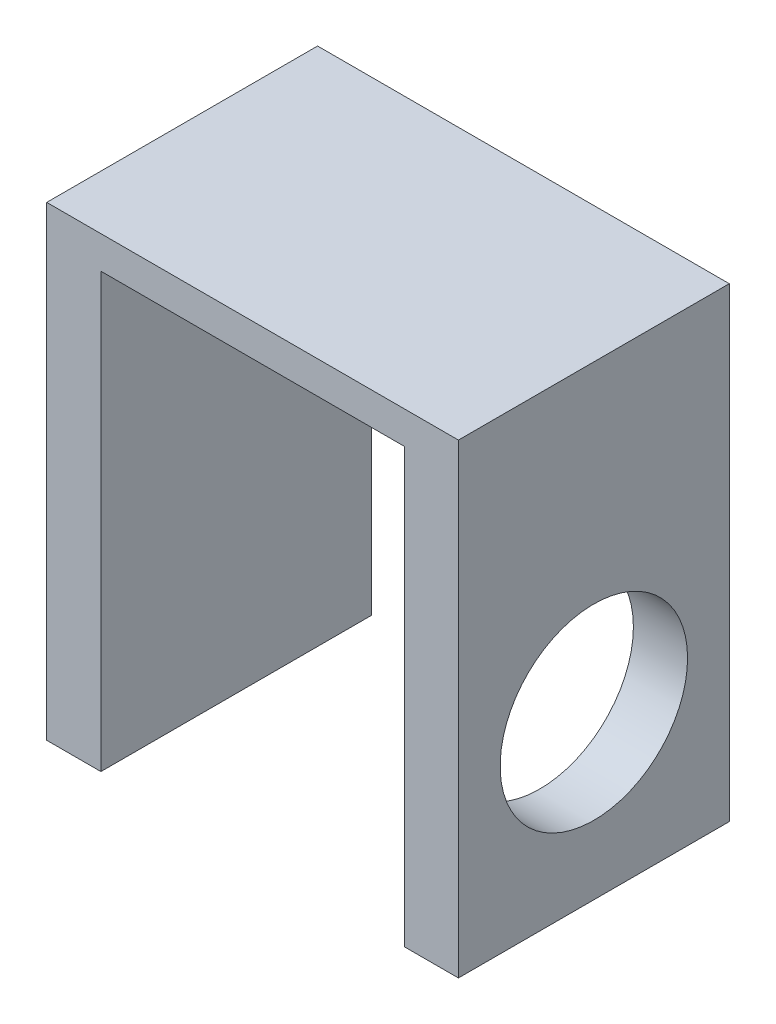
ISO-10303-21;
HEADER;
FILE_DESCRIPTION(('STEP AP214'),'2;1');
FILE_NAME('part.step','',(''),(''),'','','');
FILE_SCHEMA(('AUTOMOTIVE_DESIGN { 1 0 10303 214 1 1 1 1 }'));
ENDSEC;
DATA;
#1=APPLICATION_CONTEXT('core data for automotive mechanical design processes');
#2=APPLICATION_PROTOCOL_DEFINITION('international standard','automotive_design',2000,#1);
#3=PRODUCT_CONTEXT('',#1,'mechanical');
#4=PRODUCT('Part','Part','',(#3));
#5=PRODUCT_RELATED_PRODUCT_CATEGORY('part','',(#4));
#6=PRODUCT_DEFINITION_FORMATION('','',#4);
#7=PRODUCT_DEFINITION_CONTEXT('part definition',#1,'design');
#8=PRODUCT_DEFINITION('design','',#6,#7);
#9=PRODUCT_DEFINITION_SHAPE('','',#8);
#10=(LENGTH_UNIT() NAMED_UNIT(*) SI_UNIT(.MILLI.,.METRE.));
#11=(NAMED_UNIT(*) PLANE_ANGLE_UNIT() SI_UNIT($,.RADIAN.));
#12=(NAMED_UNIT(*) SI_UNIT($,.STERADIAN.) SOLID_ANGLE_UNIT());
#13=UNCERTAINTY_MEASURE_WITH_UNIT(LENGTH_MEASURE(1.E-05),#10,'distance_accuracy_value','');
#14=(GEOMETRIC_REPRESENTATION_CONTEXT(3) GLOBAL_UNCERTAINTY_ASSIGNED_CONTEXT((#13)) GLOBAL_UNIT_ASSIGNED_CONTEXT((#10,
#11,#12)) REPRESENTATION_CONTEXT('',''));
#15=CARTESIAN_POINT('',(0.,0.,0.));
#16=DIRECTION('',(0.,0.,1.));
#17=DIRECTION('',(1.,0.,0.));
#18=AXIS2_PLACEMENT_3D('',#15,#16,#17);
#19=CARTESIAN_POINT('',(0.,-6.,0.));
#20=DIRECTION('',(0.,-1.,0.));
#21=DIRECTION('',(0.,0.,-1.));
#22=AXIS2_PLACEMENT_3D('',#19,#20,#21);
#23=PLANE('',#22);
#24=DIRECTION('',(1.,0.,0.));
#25=VECTOR('',#24,1.);
#26=CARTESIAN_POINT('',(0.,-6.,0.));
#27=LINE('',#26,#25);
#28=CARTESIAN_POINT('',(9.99999999999999,-6.,0.));
#29=VERTEX_POINT('',#28);
#30=CARTESIAN_POINT('',(66.,-6.,0.));
#31=VERTEX_POINT('',#30);
#32=EDGE_CURVE('E64',#29,#31,#27,.T.);
#33=ORIENTED_EDGE('',*,*,#32,.F.);
#34=DIRECTION('',(0.,0.,-1.));
#35=VECTOR('',#34,1.);
#36=CARTESIAN_POINT('',(9.99999999999999,-6.,0.));
#37=LINE('',#36,#35);
#38=CARTESIAN_POINT('',(9.99999999999999,-6.,-50.));
#39=VERTEX_POINT('',#38);
#40=EDGE_CURVE('E127',#29,#39,#37,.T.);
#41=ORIENTED_EDGE('',*,*,#40,.T.);
#42=DIRECTION('',(-1.,0.,0.));
#43=VECTOR('',#42,1.);
#44=CARTESIAN_POINT('',(0.,-6.,-50.));
#45=LINE('',#44,#43);
#46=CARTESIAN_POINT('',(66.,-6.,-50.));
#47=VERTEX_POINT('',#46);
#48=EDGE_CURVE('E117',#47,#39,#45,.T.);
#49=ORIENTED_EDGE('',*,*,#48,.F.);
#50=DIRECTION('',(0.,0.,-1.));
#51=VECTOR('',#50,1.);
#52=CARTESIAN_POINT('',(66.,-6.,0.));
#53=LINE('',#52,#51);
#54=EDGE_CURVE('E139',#31,#47,#53,.T.);
#55=ORIENTED_EDGE('',*,*,#54,.F.);
#56=EDGE_LOOP('',(#33,#41,#49,#55));
#57=FACE_BOUND('',#56,.T.);
#58=ADVANCED_FACE('F39',(#57),#23,.T.);
#59=CARTESIAN_POINT('',(0.,-6.,0.));
#60=DIRECTION('',(-1.,0.,0.));
#61=DIRECTION('',(0.,0.,1.));
#62=AXIS2_PLACEMENT_3D('',#59,#60,#61);
#63=PLANE('',#62);
#64=DIRECTION('',(0.,0.,1.));
#65=VECTOR('',#64,1.);
#66=CARTESIAN_POINT('',(0.,0.,0.));
#67=LINE('',#66,#65);
#68=CARTESIAN_POINT('',(0.,0.,-50.));
#69=VERTEX_POINT('',#68);
#70=CARTESIAN_POINT('',(0.,0.,0.));
#71=VERTEX_POINT('',#70);
#72=EDGE_CURVE('E158',#69,#71,#67,.T.);
#73=ORIENTED_EDGE('',*,*,#72,.F.);
#74=DIRECTION('',(0.,1.,0.));
#75=VECTOR('',#74,1.);
#76=CARTESIAN_POINT('',(0.,-6.,-50.));
#77=LINE('',#76,#75);
#78=CARTESIAN_POINT('',(0.,-86.,-50.));
#79=VERTEX_POINT('',#78);
#80=EDGE_CURVE('E11',#79,#69,#77,.T.);
#81=ORIENTED_EDGE('',*,*,#80,.F.);
#82=DIRECTION('',(0.,0.,1.));
#83=VECTOR('',#82,1.);
#84=CARTESIAN_POINT('',(0.,-86.,0.));
#85=LINE('',#84,#83);
#86=CARTESIAN_POINT('',(0.,-86.,0.));
#87=VERTEX_POINT('',#86);
#88=EDGE_CURVE('E122',#79,#87,#85,.T.);
#89=ORIENTED_EDGE('',*,*,#88,.T.);
#90=DIRECTION('',(0.,1.,0.));
#91=VECTOR('',#90,1.);
#92=CARTESIAN_POINT('',(0.,-6.,0.));
#93=LINE('',#92,#91);
#94=EDGE_CURVE('E106',#87,#71,#93,.T.);
#95=ORIENTED_EDGE('',*,*,#94,.T.);
#96=EDGE_LOOP('',(#73,#81,#89,#95));
#97=FACE_BOUND('',#96,.T.);
#98=ADVANCED_FACE('F41',(#97),#63,.T.);
#99=CARTESIAN_POINT('',(0.,-6.,-50.));
#100=DIRECTION('',(0.,0.,-1.));
#101=DIRECTION('',(-1.,0.,0.));
#102=AXIS2_PLACEMENT_3D('',#99,#100,#101);
#103=PLANE('',#102);
#104=DIRECTION('',(0.,1.,0.));
#105=VECTOR('',#104,1.);
#106=CARTESIAN_POINT('',(66.,-86.,-50.));
#107=LINE('',#106,#105);
#108=CARTESIAN_POINT('',(66.,-86.,-50.));
#109=VERTEX_POINT('',#108);
#110=EDGE_CURVE('E150',#109,#47,#107,.T.);
#111=ORIENTED_EDGE('',*,*,#110,.T.);
#112=ORIENTED_EDGE('',*,*,#48,.T.);
#113=DIRECTION('',(0.,1.,0.));
#114=VECTOR('',#113,1.);
#115=CARTESIAN_POINT('',(9.99999999999999,-86.,-50.));
#116=LINE('',#115,#114);
#117=CARTESIAN_POINT('',(9.99999999999999,-86.,-50.));
#118=VERTEX_POINT('',#117);
#119=EDGE_CURVE('E56',#118,#39,#116,.T.);
#120=ORIENTED_EDGE('',*,*,#119,.F.);
#121=DIRECTION('',(-1.,0.,0.));
#122=VECTOR('',#121,1.);
#123=CARTESIAN_POINT('',(0.,-86.,-50.));
#124=LINE('',#123,#122);
#125=EDGE_CURVE('E134',#118,#79,#124,.T.);
#126=ORIENTED_EDGE('',*,*,#125,.T.);
#127=ORIENTED_EDGE('',*,*,#80,.T.);
#128=DIRECTION('',(-1.,0.,0.));
#129=VECTOR('',#128,1.);
#130=CARTESIAN_POINT('',(0.,0.,-50.));
#131=LINE('',#130,#129);
#132=CARTESIAN_POINT('',(76.,0.,-50.));
#133=VERTEX_POINT('',#132);
#134=EDGE_CURVE('E160',#133,#69,#131,.T.);
#135=ORIENTED_EDGE('',*,*,#134,.F.);
#136=DIRECTION('',(0.,1.,0.));
#137=VECTOR('',#136,1.);
#138=CARTESIAN_POINT('',(76.,-6.,-50.));
#139=LINE('',#138,#137);
#140=CARTESIAN_POINT('',(76.,-86.,-50.));
#141=VERTEX_POINT('',#140);
#142=EDGE_CURVE('E48',#141,#133,#139,.T.);
#143=ORIENTED_EDGE('',*,*,#142,.F.);
#144=DIRECTION('',(1.,0.,0.));
#145=VECTOR('',#144,1.);
#146=CARTESIAN_POINT('',(76.,-86.,-50.));
#147=LINE('',#146,#145);
#148=EDGE_CURVE('E147',#109,#141,#147,.T.);
#149=ORIENTED_EDGE('',*,*,#148,.F.);
#150=EDGE_LOOP('',(#111,#112,#120,#126,#127,#135,#143,#149));
#151=FACE_BOUND('',#150,.T.);
#152=ADVANCED_FACE('F180',(#151),#103,.T.);
#153=CARTESIAN_POINT('',(76.,-6.,0.));
#154=DIRECTION('',(1.,0.,0.));
#155=DIRECTION('',(0.,0.,-1.));
#156=AXIS2_PLACEMENT_3D('',#153,#154,#155);
#157=PLANE('',#156);
#158=CARTESIAN_POINT('',(76.,-56.,-25.));
#159=DIRECTION('',(1.,0.,0.));
#160=DIRECTION('',(0.,0.,-1.));
#161=AXIS2_PLACEMENT_3D('',#158,#159,#160);
#162=CIRCLE('',#161,17.3);
#163=CARTESIAN_POINT('',(76.,-56.,-42.3));
#164=VERTEX_POINT('',#163);
#165=EDGE_CURVE('E131',#164,#164,#162,.T.);
#166=ORIENTED_EDGE('',*,*,#165,.F.);
#167=EDGE_LOOP('',(#166));
#168=FACE_BOUND('',#167,.T.);
#169=ORIENTED_EDGE('',*,*,#142,.T.);
#170=DIRECTION('',(0.,0.,-1.));
#171=VECTOR('',#170,1.);
#172=CARTESIAN_POINT('',(76.,0.,0.));
#173=LINE('',#172,#171);
#174=CARTESIAN_POINT('',(76.,0.,0.));
#175=VERTEX_POINT('',#174);
#176=EDGE_CURVE('E165',#175,#133,#173,.T.);
#177=ORIENTED_EDGE('',*,*,#176,.F.);
#178=DIRECTION('',(0.,1.,0.));
#179=VECTOR('',#178,1.);
#180=CARTESIAN_POINT('',(76.,-6.,0.));
#181=LINE('',#180,#179);
#182=CARTESIAN_POINT('',(76.,-86.,0.));
#183=VERTEX_POINT('',#182);
#184=EDGE_CURVE('E116',#183,#175,#181,.T.);
#185=ORIENTED_EDGE('',*,*,#184,.F.);
#186=DIRECTION('',(0.,0.,1.));
#187=VECTOR('',#186,1.);
#188=CARTESIAN_POINT('',(76.,-86.,0.));
#189=LINE('',#188,#187);
#190=EDGE_CURVE('E140',#141,#183,#189,.T.);
#191=ORIENTED_EDGE('',*,*,#190,.F.);
#192=EDGE_LOOP('',(#169,#177,#185,#191));
#193=FACE_BOUND('',#192,.T.);
#194=ADVANCED_FACE('F175',(#168,#193),#157,.T.);
#195=CARTESIAN_POINT('',(0.,-6.,0.));
#196=DIRECTION('',(0.,0.,1.));
#197=DIRECTION('',(1.,0.,0.));
#198=AXIS2_PLACEMENT_3D('',#195,#196,#197);
#199=PLANE('',#198);
#200=ORIENTED_EDGE('',*,*,#184,.T.);
#201=DIRECTION('',(1.,0.,0.));
#202=VECTOR('',#201,1.);
#203=CARTESIAN_POINT('',(0.,0.,0.));
#204=LINE('',#203,#202);
#205=EDGE_CURVE('E111',#71,#175,#204,.T.);
#206=ORIENTED_EDGE('',*,*,#205,.F.);
#207=ORIENTED_EDGE('',*,*,#94,.F.);
#208=DIRECTION('',(1.,0.,0.));
#209=VECTOR('',#208,1.);
#210=CARTESIAN_POINT('',(0.,-86.,0.));
#211=LINE('',#210,#209);
#212=CARTESIAN_POINT('',(9.99999999999999,-86.,0.));
#213=VERTEX_POINT('',#212);
#214=EDGE_CURVE('E109',#87,#213,#211,.T.);
#215=ORIENTED_EDGE('',*,*,#214,.T.);
#216=DIRECTION('',(0.,1.,0.));
#217=VECTOR('',#216,1.);
#218=CARTESIAN_POINT('',(9.99999999999999,-86.,0.));
#219=LINE('',#218,#217);
#220=EDGE_CURVE('E137',#213,#29,#219,.T.);
#221=ORIENTED_EDGE('',*,*,#220,.T.);
#222=ORIENTED_EDGE('',*,*,#32,.T.);
#223=DIRECTION('',(0.,1.,0.));
#224=VECTOR('',#223,1.);
#225=CARTESIAN_POINT('',(66.,-86.,0.));
#226=LINE('',#225,#224);
#227=CARTESIAN_POINT('',(66.,-86.,0.));
#228=VERTEX_POINT('',#227);
#229=EDGE_CURVE('E155',#228,#31,#226,.T.);
#230=ORIENTED_EDGE('',*,*,#229,.F.);
#231=DIRECTION('',(-1.,0.,0.));
#232=VECTOR('',#231,1.);
#233=CARTESIAN_POINT('',(76.,-86.,0.));
#234=LINE('',#233,#232);
#235=EDGE_CURVE('E143',#183,#228,#234,.T.);
#236=ORIENTED_EDGE('',*,*,#235,.F.);
#237=EDGE_LOOP('',(#200,#206,#207,#215,#221,#222,#230,#236));
#238=FACE_BOUND('',#237,.T.);
#239=ADVANCED_FACE('F108',(#238),#199,.T.);
#240=CARTESIAN_POINT('',(0.,0.,0.));
#241=DIRECTION('',(0.,-1.,0.));
#242=DIRECTION('',(0.,0.,-1.));
#243=AXIS2_PLACEMENT_3D('',#240,#241,#242);
#244=PLANE('',#243);
#245=ORIENTED_EDGE('',*,*,#72,.T.);
#246=ORIENTED_EDGE('',*,*,#205,.T.);
#247=ORIENTED_EDGE('',*,*,#176,.T.);
#248=ORIENTED_EDGE('',*,*,#134,.T.);
#249=EDGE_LOOP('',(#245,#246,#247,#248));
#250=FACE_BOUND('',#249,.T.);
#251=ADVANCED_FACE('F178',(#250),#244,.F.);
#252=CARTESIAN_POINT('',(66.,-86.,0.));
#253=DIRECTION('',(1.,0.,0.));
#254=DIRECTION('',(0.,0.,-1.));
#255=AXIS2_PLACEMENT_3D('',#252,#253,#254);
#256=PLANE('',#255);
#257=CARTESIAN_POINT('',(66.,-56.,-25.));
#258=DIRECTION('',(1.,0.,0.));
#259=DIRECTION('',(0.,0.,-1.));
#260=AXIS2_PLACEMENT_3D('',#257,#258,#259);
#261=CIRCLE('',#260,17.3);
#262=CARTESIAN_POINT('',(66.,-56.,-42.3));
#263=VERTEX_POINT('',#262);
#264=EDGE_CURVE('E43',#263,#263,#261,.T.);
#265=ORIENTED_EDGE('',*,*,#264,.T.);
#266=EDGE_LOOP('',(#265));
#267=FACE_BOUND('',#266,.T.);
#268=ORIENTED_EDGE('',*,*,#54,.T.);
#269=ORIENTED_EDGE('',*,*,#110,.F.);
#270=DIRECTION('',(0.,0.,-1.));
#271=VECTOR('',#270,1.);
#272=CARTESIAN_POINT('',(66.,-86.,0.));
#273=LINE('',#272,#271);
#274=EDGE_CURVE('E145',#228,#109,#273,.T.);
#275=ORIENTED_EDGE('',*,*,#274,.F.);
#276=ORIENTED_EDGE('',*,*,#229,.T.);
#277=EDGE_LOOP('',(#268,#269,#275,#276));
#278=FACE_BOUND('',#277,.T.);
#279=ADVANCED_FACE('F185',(#267,#278),#256,.F.);
#280=CARTESIAN_POINT('',(0.,-86.,0.));
#281=DIRECTION('',(0.,1.,0.));
#282=DIRECTION('',(0.,0.,1.));
#283=AXIS2_PLACEMENT_3D('',#280,#281,#282);
#284=PLANE('',#283);
#285=ORIENTED_EDGE('',*,*,#190,.T.);
#286=ORIENTED_EDGE('',*,*,#235,.T.);
#287=ORIENTED_EDGE('',*,*,#274,.T.);
#288=ORIENTED_EDGE('',*,*,#148,.T.);
#289=EDGE_LOOP('',(#285,#286,#287,#288));
#290=FACE_BOUND('',#289,.T.);
#291=ADVANCED_FACE('F188',(#290),#284,.F.);
#292=CARTESIAN_POINT('',(9.99999999999999,-86.,0.));
#293=DIRECTION('',(-1.,0.,0.));
#294=DIRECTION('',(0.,0.,-1.));
#295=AXIS2_PLACEMENT_3D('',#292,#293,#294);
#296=PLANE('',#295);
#297=ORIENTED_EDGE('',*,*,#40,.F.);
#298=ORIENTED_EDGE('',*,*,#220,.F.);
#299=DIRECTION('',(0.,0.,-1.));
#300=VECTOR('',#299,1.);
#301=CARTESIAN_POINT('',(9.99999999999999,-86.,0.));
#302=LINE('',#301,#300);
#303=EDGE_CURVE('E124',#213,#118,#302,.T.);
#304=ORIENTED_EDGE('',*,*,#303,.T.);
#305=ORIENTED_EDGE('',*,*,#119,.T.);
#306=EDGE_LOOP('',(#297,#298,#304,#305));
#307=FACE_BOUND('',#306,.T.);
#308=ADVANCED_FACE('F190',(#307),#296,.F.);
#309=CARTESIAN_POINT('',(76.,-86.,0.));
#310=DIRECTION('',(0.,1.,0.));
#311=DIRECTION('',(0.,0.,1.));
#312=AXIS2_PLACEMENT_3D('',#309,#310,#311);
#313=PLANE('',#312);
#314=ORIENTED_EDGE('',*,*,#88,.F.);
#315=ORIENTED_EDGE('',*,*,#125,.F.);
#316=ORIENTED_EDGE('',*,*,#303,.F.);
#317=ORIENTED_EDGE('',*,*,#214,.F.);
#318=EDGE_LOOP('',(#314,#315,#316,#317));
#319=FACE_BOUND('',#318,.T.);
#320=ADVANCED_FACE('F120',(#319),#313,.F.);
#321=CARTESIAN_POINT('',(46.,-56.,-25.));
#322=DIRECTION('',(1.,0.,0.));
#323=DIRECTION('',(0.,0.,-1.));
#324=AXIS2_PLACEMENT_3D('',#321,#322,#323);
#325=CYLINDRICAL_SURFACE('',#324,17.3);
#326=ORIENTED_EDGE('',*,*,#165,.T.);
#327=EDGE_LOOP('',(#326));
#328=FACE_BOUND('',#327,.T.);
#329=ORIENTED_EDGE('',*,*,#264,.F.);
#330=EDGE_LOOP('',(#329));
#331=FACE_BOUND('',#330,.T.);
#332=ADVANCED_FACE('F229',(#328,#331),#325,.F.);
#333=CLOSED_SHELL('',(#58,#98,#152,#194,#239,#251,#279,#291,#308,#320,#332));
#334=MANIFOLD_SOLID_BREP('B2',#333);
#335=ADVANCED_BREP_SHAPE_REPRESENTATION('',(#18,#334),#14);
#336=SHAPE_DEFINITION_REPRESENTATION(#9,#335);
ENDSEC;
END-ISO-10303-21;
